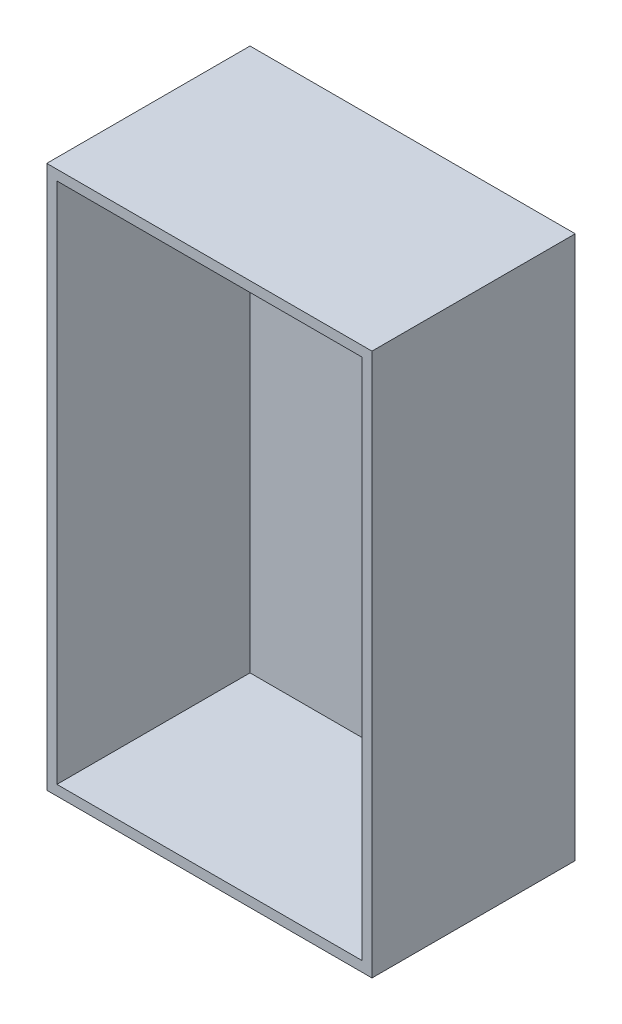
ISO-10303-21;
HEADER;
FILE_DESCRIPTION(('STEP AP214'),'2;1');
FILE_NAME('part.step','',(''),(''),'','','');
FILE_SCHEMA(('AUTOMOTIVE_DESIGN { 1 0 10303 214 1 1 1 1 }'));
ENDSEC;
DATA;
#1=APPLICATION_CONTEXT('core data for automotive mechanical design processes');
#2=APPLICATION_PROTOCOL_DEFINITION('international standard','automotive_design',2000,#1);
#3=PRODUCT_CONTEXT('',#1,'mechanical');
#4=PRODUCT('Part','Part','',(#3));
#5=PRODUCT_RELATED_PRODUCT_CATEGORY('part','',(#4));
#6=PRODUCT_DEFINITION_FORMATION('','',#4);
#7=PRODUCT_DEFINITION_CONTEXT('part definition',#1,'design');
#8=PRODUCT_DEFINITION('design','',#6,#7);
#9=PRODUCT_DEFINITION_SHAPE('','',#8);
#10=(LENGTH_UNIT() NAMED_UNIT(*) SI_UNIT(.MILLI.,.METRE.));
#11=(NAMED_UNIT(*) PLANE_ANGLE_UNIT() SI_UNIT($,.RADIAN.));
#12=(NAMED_UNIT(*) SI_UNIT($,.STERADIAN.) SOLID_ANGLE_UNIT());
#13=UNCERTAINTY_MEASURE_WITH_UNIT(LENGTH_MEASURE(1.E-05),#10,'distance_accuracy_value','');
#14=(GEOMETRIC_REPRESENTATION_CONTEXT(3) GLOBAL_UNCERTAINTY_ASSIGNED_CONTEXT((#13)) GLOBAL_UNIT_ASSIGNED_CONTEXT((#10,
#11,#12)) REPRESENTATION_CONTEXT('',''));
#15=CARTESIAN_POINT('',(0.,0.,0.));
#16=DIRECTION('',(0.,0.,1.));
#17=DIRECTION('',(1.,0.,0.));
#18=AXIS2_PLACEMENT_3D('',#15,#16,#17);
#19=CARTESIAN_POINT('',(0.,-6.41900000000002,2.));
#20=DIRECTION('',(0.,1.,0.));
#21=DIRECTION('',(-1.,0.,0.));
#22=AXIS2_PLACEMENT_3D('',#19,#20,#21);
#23=PLANE('',#22);
#24=DIRECTION('',(1.,0.,0.));
#25=VECTOR('',#24,1.);
#26=CARTESIAN_POINT('',(0.,-6.41900000000002,0.));
#27=LINE('',#26,#25);
#28=CARTESIAN_POINT('',(0.,-6.41900000000002,0.));
#29=VERTEX_POINT('',#28);
#30=CARTESIAN_POINT('',(64.,-6.41900000000001,0.));
#31=VERTEX_POINT('',#30);
#32=EDGE_CURVE('E175',#29,#31,#27,.T.);
#33=ORIENTED_EDGE('',*,*,#32,.T.);
#34=DIRECTION('',(0.,0.,-1.));
#35=VECTOR('',#34,1.);
#36=CARTESIAN_POINT('',(64.,-6.41900000000001,2.));
#37=LINE('',#36,#35);
#38=CARTESIAN_POINT('',(64.,-6.41900000000001,40.));
#39=VERTEX_POINT('',#38);
#40=EDGE_CURVE('E11',#39,#31,#37,.T.);
#41=ORIENTED_EDGE('',*,*,#40,.F.);
#42=DIRECTION('',(1.,0.,0.));
#43=VECTOR('',#42,1.);
#44=CARTESIAN_POINT('',(0.,-6.41900000000002,40.));
#45=LINE('',#44,#43);
#46=CARTESIAN_POINT('',(0.,-6.41900000000002,40.));
#47=VERTEX_POINT('',#46);
#48=EDGE_CURVE('E152',#47,#39,#45,.T.);
#49=ORIENTED_EDGE('',*,*,#48,.F.);
#50=DIRECTION('',(0.,0.,-1.));
#51=VECTOR('',#50,1.);
#52=CARTESIAN_POINT('',(0.,-6.41900000000002,2.));
#53=LINE('',#52,#51);
#54=EDGE_CURVE('E191',#47,#29,#53,.T.);
#55=ORIENTED_EDGE('',*,*,#54,.T.);
#56=EDGE_LOOP('',(#33,#41,#49,#55));
#57=FACE_BOUND('',#56,.T.);
#58=ADVANCED_FACE('F45',(#57),#23,.F.);
#59=CARTESIAN_POINT('',(64.,0.,2.));
#60=DIRECTION('',(-1.,0.,0.));
#61=DIRECTION('',(0.,0.,1.));
#62=AXIS2_PLACEMENT_3D('',#59,#60,#61);
#63=PLANE('',#62);
#64=DIRECTION('',(0.,1.,0.));
#65=VECTOR('',#64,1.);
#66=CARTESIAN_POINT('',(64.,0.,0.));
#67=LINE('',#66,#65);
#68=CARTESIAN_POINT('',(64.,100.419,0.));
#69=VERTEX_POINT('',#68);
#70=EDGE_CURVE('E179',#31,#69,#67,.T.);
#71=ORIENTED_EDGE('',*,*,#70,.T.);
#72=DIRECTION('',(0.,0.,-1.));
#73=VECTOR('',#72,1.);
#74=CARTESIAN_POINT('',(64.,100.419,2.));
#75=LINE('',#74,#73);
#76=CARTESIAN_POINT('',(64.,100.419,40.));
#77=VERTEX_POINT('',#76);
#78=EDGE_CURVE('E53',#77,#69,#75,.T.);
#79=ORIENTED_EDGE('',*,*,#78,.F.);
#80=DIRECTION('',(0.,1.,0.));
#81=VECTOR('',#80,1.);
#82=CARTESIAN_POINT('',(64.,-6.41900000000001,40.));
#83=LINE('',#82,#81);
#84=EDGE_CURVE('E156',#39,#77,#83,.T.);
#85=ORIENTED_EDGE('',*,*,#84,.F.);
#86=ORIENTED_EDGE('',*,*,#40,.T.);
#87=EDGE_LOOP('',(#71,#79,#85,#86));
#88=FACE_BOUND('',#87,.T.);
#89=ADVANCED_FACE('F203',(#88),#63,.F.);
#90=CARTESIAN_POINT('',(0.,100.419,2.));
#91=DIRECTION('',(0.,1.,0.));
#92=DIRECTION('',(-1.,0.,0.));
#93=AXIS2_PLACEMENT_3D('',#90,#91,#92);
#94=PLANE('',#93);
#95=DIRECTION('',(1.,0.,0.));
#96=VECTOR('',#95,1.);
#97=CARTESIAN_POINT('',(0.,100.419,0.));
#98=LINE('',#97,#96);
#99=CARTESIAN_POINT('',(0.,100.419,0.));
#100=VERTEX_POINT('',#99);
#101=EDGE_CURVE('E183',#100,#69,#98,.T.);
#102=ORIENTED_EDGE('',*,*,#101,.F.);
#103=DIRECTION('',(0.,0.,-1.));
#104=VECTOR('',#103,1.);
#105=CARTESIAN_POINT('',(0.,100.419,2.));
#106=LINE('',#105,#104);
#107=CARTESIAN_POINT('',(0.,100.419,40.));
#108=VERTEX_POINT('',#107);
#109=EDGE_CURVE('E194',#108,#100,#106,.T.);
#110=ORIENTED_EDGE('',*,*,#109,.F.);
#111=DIRECTION('',(-1.,0.,0.));
#112=VECTOR('',#111,1.);
#113=CARTESIAN_POINT('',(0.,100.419,40.));
#114=LINE('',#113,#112);
#115=EDGE_CURVE('E160',#77,#108,#114,.T.);
#116=ORIENTED_EDGE('',*,*,#115,.F.);
#117=ORIENTED_EDGE('',*,*,#78,.T.);
#118=EDGE_LOOP('',(#102,#110,#116,#117));
#119=FACE_BOUND('',#118,.T.);
#120=ADVANCED_FACE('F200',(#119),#94,.T.);
#121=CARTESIAN_POINT('',(0.,0.,2.));
#122=DIRECTION('',(-1.,0.,0.));
#123=DIRECTION('',(0.,-1.,0.));
#124=AXIS2_PLACEMENT_3D('',#121,#122,#123);
#125=PLANE('',#124);
#126=DIRECTION('',(0.,1.,0.));
#127=VECTOR('',#126,1.);
#128=CARTESIAN_POINT('',(0.,0.,0.));
#129=LINE('',#128,#127);
#130=EDGE_CURVE('E187',#29,#100,#129,.T.);
#131=ORIENTED_EDGE('',*,*,#130,.F.);
#132=ORIENTED_EDGE('',*,*,#54,.F.);
#133=DIRECTION('',(0.,-1.,0.));
#134=VECTOR('',#133,1.);
#135=CARTESIAN_POINT('',(0.,-6.41900000000002,40.));
#136=LINE('',#135,#134);
#137=EDGE_CURVE('E126',#108,#47,#136,.T.);
#138=ORIENTED_EDGE('',*,*,#137,.F.);
#139=ORIENTED_EDGE('',*,*,#109,.T.);
#140=EDGE_LOOP('',(#131,#132,#138,#139));
#141=FACE_BOUND('',#140,.T.);
#142=ADVANCED_FACE('F209',(#141),#125,.T.);
#143=CARTESIAN_POINT('',(0.,0.,0.));
#144=DIRECTION('',(0.,0.,1.));
#145=DIRECTION('',(1.,0.,0.));
#146=AXIS2_PLACEMENT_3D('',#143,#144,#145);
#147=PLANE('',#146);
#148=ORIENTED_EDGE('',*,*,#32,.F.);
#149=ORIENTED_EDGE('',*,*,#130,.T.);
#150=ORIENTED_EDGE('',*,*,#101,.T.);
#151=ORIENTED_EDGE('',*,*,#70,.F.);
#152=EDGE_LOOP('',(#148,#149,#150,#151));
#153=FACE_BOUND('',#152,.T.);
#154=ADVANCED_FACE('F206',(#153),#147,.F.);
#155=CARTESIAN_POINT('',(0.,0.,40.));
#156=DIRECTION('',(0.,0.,-1.));
#157=DIRECTION('',(-1.,0.,0.));
#158=AXIS2_PLACEMENT_3D('',#155,#156,#157);
#159=PLANE('',#158);
#160=ORIENTED_EDGE('',*,*,#137,.T.);
#161=ORIENTED_EDGE('',*,*,#48,.T.);
#162=ORIENTED_EDGE('',*,*,#84,.T.);
#163=ORIENTED_EDGE('',*,*,#115,.T.);
#164=EDGE_LOOP('',(#160,#161,#162,#163));
#165=FACE_BOUND('',#164,.T.);
#166=DIRECTION('',(0.,-1.,0.));
#167=VECTOR('',#166,1.);
#168=CARTESIAN_POINT('',(2.,-4.41900000000001,40.));
#169=LINE('',#168,#167);
#170=CARTESIAN_POINT('',(1.99999999999999,98.419,40.));
#171=VERTEX_POINT('',#170);
#172=CARTESIAN_POINT('',(2.,-4.41900000000001,40.));
#173=VERTEX_POINT('',#172);
#174=EDGE_CURVE('E109',#171,#173,#169,.T.);
#175=ORIENTED_EDGE('',*,*,#174,.F.);
#176=DIRECTION('',(-1.,0.,0.));
#177=VECTOR('',#176,1.);
#178=CARTESIAN_POINT('',(1.99999999999999,98.419,40.));
#179=LINE('',#178,#177);
#180=CARTESIAN_POINT('',(62.,98.419,40.));
#181=VERTEX_POINT('',#180);
#182=EDGE_CURVE('E136',#181,#171,#179,.T.);
#183=ORIENTED_EDGE('',*,*,#182,.F.);
#184=DIRECTION('',(0.,1.,0.));
#185=VECTOR('',#184,1.);
#186=CARTESIAN_POINT('',(62.,-4.41900000000002,40.));
#187=LINE('',#186,#185);
#188=CARTESIAN_POINT('',(62.,-4.41900000000002,40.));
#189=VERTEX_POINT('',#188);
#190=EDGE_CURVE('E132',#189,#181,#187,.T.);
#191=ORIENTED_EDGE('',*,*,#190,.F.);
#192=DIRECTION('',(1.,0.,0.));
#193=VECTOR('',#192,1.);
#194=CARTESIAN_POINT('',(2.,-4.41900000000001,40.));
#195=LINE('',#194,#193);
#196=EDGE_CURVE('E119',#173,#189,#195,.T.);
#197=ORIENTED_EDGE('',*,*,#196,.F.);
#198=EDGE_LOOP('',(#175,#183,#191,#197));
#199=FACE_BOUND('',#198,.T.);
#200=ADVANCED_FACE('F130',(#165,#199),#159,.F.);
#201=CARTESIAN_POINT('',(2.,-4.41900000000001,40.));
#202=DIRECTION('',(1.,0.,0.));
#203=DIRECTION('',(0.,1.,0.));
#204=AXIS2_PLACEMENT_3D('',#201,#202,#203);
#205=PLANE('',#204);
#206=DIRECTION('',(0.,0.,-1.));
#207=VECTOR('',#206,1.);
#208=CARTESIAN_POINT('',(2.,-4.41900000000001,40.));
#209=LINE('',#208,#207);
#210=CARTESIAN_POINT('',(2.,-4.41900000000001,2.));
#211=VERTEX_POINT('',#210);
#212=EDGE_CURVE('E112',#173,#211,#209,.T.);
#213=ORIENTED_EDGE('',*,*,#212,.T.);
#214=DIRECTION('',(0.,1.,0.));
#215=VECTOR('',#214,1.);
#216=CARTESIAN_POINT('',(2.,0.,2.));
#217=LINE('',#216,#215);
#218=CARTESIAN_POINT('',(1.99999999999999,98.419,2.));
#219=VERTEX_POINT('',#218);
#220=EDGE_CURVE('E60',#211,#219,#217,.T.);
#221=ORIENTED_EDGE('',*,*,#220,.T.);
#222=DIRECTION('',(0.,0.,-1.));
#223=VECTOR('',#222,1.);
#224=CARTESIAN_POINT('',(1.99999999999999,98.419,40.));
#225=LINE('',#224,#223);
#226=EDGE_CURVE('E114',#171,#219,#225,.T.);
#227=ORIENTED_EDGE('',*,*,#226,.F.);
#228=ORIENTED_EDGE('',*,*,#174,.T.);
#229=EDGE_LOOP('',(#213,#221,#227,#228));
#230=FACE_BOUND('',#229,.T.);
#231=ADVANCED_FACE('F111',(#230),#205,.T.);
#232=CARTESIAN_POINT('',(2.,-4.41900000000001,40.));
#233=DIRECTION('',(0.,1.,0.));
#234=DIRECTION('',(-1.,0.,0.));
#235=AXIS2_PLACEMENT_3D('',#232,#233,#234);
#236=PLANE('',#235);
#237=DIRECTION('',(0.,0.,-1.));
#238=VECTOR('',#237,1.);
#239=CARTESIAN_POINT('',(62.,-4.41900000000002,40.));
#240=LINE('',#239,#238);
#241=CARTESIAN_POINT('',(62.,-4.41900000000002,2.));
#242=VERTEX_POINT('',#241);
#243=EDGE_CURVE('E127',#189,#242,#240,.T.);
#244=ORIENTED_EDGE('',*,*,#243,.T.);
#245=DIRECTION('',(-1.,0.,0.));
#246=VECTOR('',#245,1.);
#247=CARTESIAN_POINT('',(0.,-4.41900000000001,2.));
#248=LINE('',#247,#246);
#249=EDGE_CURVE('E64',#242,#211,#248,.T.);
#250=ORIENTED_EDGE('',*,*,#249,.T.);
#251=ORIENTED_EDGE('',*,*,#212,.F.);
#252=ORIENTED_EDGE('',*,*,#196,.T.);
#253=EDGE_LOOP('',(#244,#250,#251,#252));
#254=FACE_BOUND('',#253,.T.);
#255=ADVANCED_FACE('F123',(#254),#236,.T.);
#256=CARTESIAN_POINT('',(62.,-4.41900000000002,40.));
#257=DIRECTION('',(-1.,0.,0.));
#258=DIRECTION('',(0.,0.,1.));
#259=AXIS2_PLACEMENT_3D('',#256,#257,#258);
#260=PLANE('',#259);
#261=DIRECTION('',(0.,0.,-1.));
#262=VECTOR('',#261,1.);
#263=CARTESIAN_POINT('',(62.,98.419,40.));
#264=LINE('',#263,#262);
#265=CARTESIAN_POINT('',(62.,98.419,2.));
#266=VERTEX_POINT('',#265);
#267=EDGE_CURVE('E143',#181,#266,#264,.T.);
#268=ORIENTED_EDGE('',*,*,#267,.T.);
#269=DIRECTION('',(0.,-1.,0.));
#270=VECTOR('',#269,1.);
#271=CARTESIAN_POINT('',(62.,0.,2.));
#272=LINE('',#271,#270);
#273=EDGE_CURVE('E168',#266,#242,#272,.T.);
#274=ORIENTED_EDGE('',*,*,#273,.T.);
#275=ORIENTED_EDGE('',*,*,#243,.F.);
#276=ORIENTED_EDGE('',*,*,#190,.T.);
#277=EDGE_LOOP('',(#268,#274,#275,#276));
#278=FACE_BOUND('',#277,.T.);
#279=ADVANCED_FACE('F237',(#278),#260,.T.);
#280=CARTESIAN_POINT('',(1.99999999999999,98.419,40.));
#281=DIRECTION('',(0.,-1.,0.));
#282=DIRECTION('',(1.,0.,0.));
#283=AXIS2_PLACEMENT_3D('',#280,#281,#282);
#284=PLANE('',#283);
#285=ORIENTED_EDGE('',*,*,#226,.T.);
#286=DIRECTION('',(1.,0.,0.));
#287=VECTOR('',#286,1.);
#288=CARTESIAN_POINT('',(0.,98.419,2.));
#289=LINE('',#288,#287);
#290=EDGE_CURVE('E164',#219,#266,#289,.T.);
#291=ORIENTED_EDGE('',*,*,#290,.T.);
#292=ORIENTED_EDGE('',*,*,#267,.F.);
#293=ORIENTED_EDGE('',*,*,#182,.T.);
#294=EDGE_LOOP('',(#285,#291,#292,#293));
#295=FACE_BOUND('',#294,.T.);
#296=ADVANCED_FACE('F230',(#295),#284,.T.);
#297=CARTESIAN_POINT('',(0.,0.,2.));
#298=DIRECTION('',(0.,0.,1.));
#299=DIRECTION('',(1.,0.,0.));
#300=AXIS2_PLACEMENT_3D('',#297,#298,#299);
#301=PLANE('',#300);
#302=ORIENTED_EDGE('',*,*,#220,.F.);
#303=ORIENTED_EDGE('',*,*,#249,.F.);
#304=ORIENTED_EDGE('',*,*,#273,.F.);
#305=ORIENTED_EDGE('',*,*,#290,.F.);
#306=EDGE_LOOP('',(#302,#303,#304,#305));
#307=FACE_BOUND('',#306,.T.);
#308=ADVANCED_FACE('F227',(#307),#301,.T.);
#309=CLOSED_SHELL('',(#58,#89,#120,#142,#154,#200,#231,#255,#279,#296,#308));
#310=MANIFOLD_SOLID_BREP('B2',#309);
#311=ADVANCED_BREP_SHAPE_REPRESENTATION('',(#18,#310),#14);
#312=SHAPE_DEFINITION_REPRESENTATION(#9,#311);
ENDSEC;
END-ISO-10303-21;
